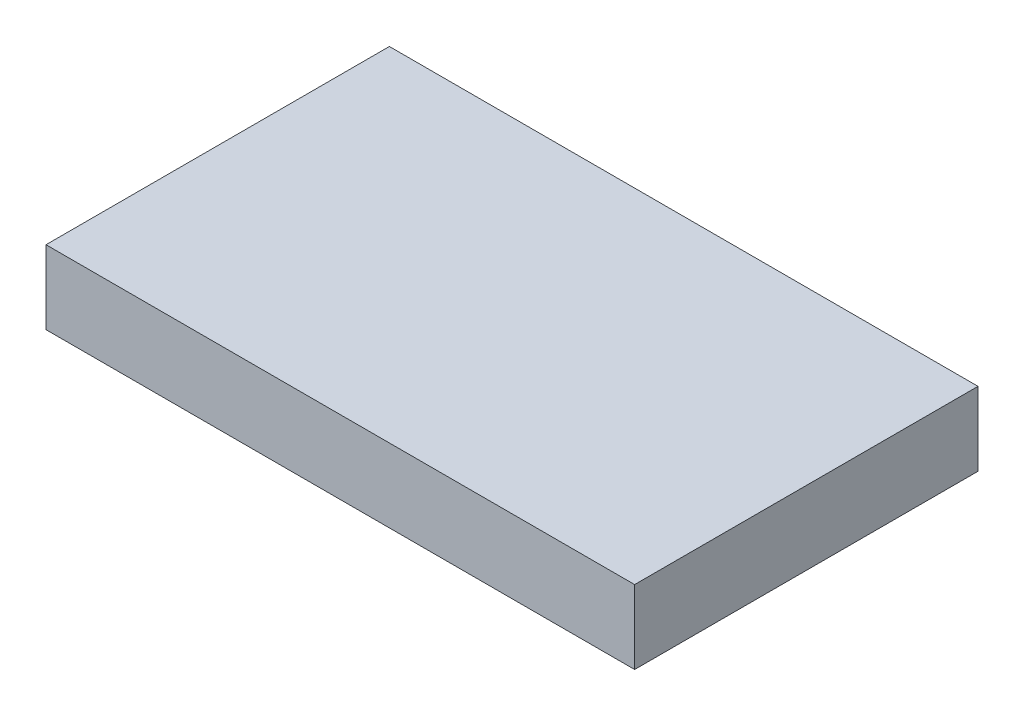
ISO-10303-21;
HEADER;
FILE_DESCRIPTION(('STEP AP214'),'2;1');
FILE_NAME('part.step','',(''),(''),'','','');
FILE_SCHEMA(('AUTOMOTIVE_DESIGN { 1 0 10303 214 1 1 1 1 }'));
ENDSEC;
DATA;
#1=APPLICATION_CONTEXT('core data for automotive mechanical design processes');
#2=APPLICATION_PROTOCOL_DEFINITION('international standard','automotive_design',2000,#1);
#3=PRODUCT_CONTEXT('',#1,'mechanical');
#4=PRODUCT('Part','Part','',(#3));
#5=PRODUCT_RELATED_PRODUCT_CATEGORY('part','',(#4));
#6=PRODUCT_DEFINITION_FORMATION('','',#4);
#7=PRODUCT_DEFINITION_CONTEXT('part definition',#1,'design');
#8=PRODUCT_DEFINITION('design','',#6,#7);
#9=PRODUCT_DEFINITION_SHAPE('','',#8);
#10=(LENGTH_UNIT() NAMED_UNIT(*) SI_UNIT(.MILLI.,.METRE.));
#11=(NAMED_UNIT(*) PLANE_ANGLE_UNIT() SI_UNIT($,.RADIAN.));
#12=(NAMED_UNIT(*) SI_UNIT($,.STERADIAN.) SOLID_ANGLE_UNIT());
#13=UNCERTAINTY_MEASURE_WITH_UNIT(LENGTH_MEASURE(1.E-05),#10,'distance_accuracy_value','');
#14=(GEOMETRIC_REPRESENTATION_CONTEXT(3) GLOBAL_UNCERTAINTY_ASSIGNED_CONTEXT((#13)) GLOBAL_UNIT_ASSIGNED_CONTEXT((#10,
#11,#12)) REPRESENTATION_CONTEXT('',''));
#15=CARTESIAN_POINT('',(0.,0.,0.));
#16=DIRECTION('',(0.,0.,1.));
#17=DIRECTION('',(1.,0.,0.));
#18=AXIS2_PLACEMENT_3D('',#15,#16,#17);
#19=CARTESIAN_POINT('',(0.,15.,0.));
#20=DIRECTION('',(1.,0.,0.));
#21=DIRECTION('',(0.,0.,-1.));
#22=AXIS2_PLACEMENT_3D('',#19,#20,#21);
#23=PLANE('',#22);
#24=DIRECTION('',(0.,0.,1.));
#25=VECTOR('',#24,1.);
#26=CARTESIAN_POINT('',(0.,0.,0.));
#27=LINE('',#26,#25);
#28=CARTESIAN_POINT('',(0.,0.,-70.));
#29=VERTEX_POINT('',#28);
#30=CARTESIAN_POINT('',(0.,0.,0.));
#31=VERTEX_POINT('',#30);
#32=EDGE_CURVE('E107',#29,#31,#27,.T.);
#33=ORIENTED_EDGE('',*,*,#32,.T.);
#34=DIRECTION('',(0.,-1.,0.));
#35=VECTOR('',#34,1.);
#36=CARTESIAN_POINT('',(0.,15.,0.));
#37=LINE('',#36,#35);
#38=CARTESIAN_POINT('',(0.,15.,0.));
#39=VERTEX_POINT('',#38);
#40=EDGE_CURVE('E11',#39,#31,#37,.T.);
#41=ORIENTED_EDGE('',*,*,#40,.F.);
#42=DIRECTION('',(0.,0.,1.));
#43=VECTOR('',#42,1.);
#44=CARTESIAN_POINT('',(0.,15.,0.));
#45=LINE('',#44,#43);
#46=CARTESIAN_POINT('',(0.,15.,-70.));
#47=VERTEX_POINT('',#46);
#48=EDGE_CURVE('E91',#47,#39,#45,.T.);
#49=ORIENTED_EDGE('',*,*,#48,.F.);
#50=DIRECTION('',(0.,-1.,0.));
#51=VECTOR('',#50,1.);
#52=CARTESIAN_POINT('',(0.,15.,-70.));
#53=LINE('',#52,#51);
#54=EDGE_CURVE('E103',#47,#29,#53,.T.);
#55=ORIENTED_EDGE('',*,*,#54,.T.);
#56=EDGE_LOOP('',(#33,#41,#49,#55));
#57=FACE_BOUND('',#56,.T.);
#58=ADVANCED_FACE('F39',(#57),#23,.F.);
#59=CARTESIAN_POINT('',(0.,15.,0.));
#60=DIRECTION('',(0.,0.,-1.));
#61=DIRECTION('',(-1.,0.,0.));
#62=AXIS2_PLACEMENT_3D('',#59,#60,#61);
#63=PLANE('',#62);
#64=DIRECTION('',(1.,0.,0.));
#65=VECTOR('',#64,1.);
#66=CARTESIAN_POINT('',(0.,0.,0.));
#67=LINE('',#66,#65);
#68=CARTESIAN_POINT('',(120.,0.,0.));
#69=VERTEX_POINT('',#68);
#70=EDGE_CURVE('E96',#31,#69,#67,.T.);
#71=ORIENTED_EDGE('',*,*,#70,.T.);
#72=DIRECTION('',(0.,-1.,0.));
#73=VECTOR('',#72,1.);
#74=CARTESIAN_POINT('',(120.,15.,0.));
#75=LINE('',#74,#73);
#76=CARTESIAN_POINT('',(120.,15.,0.));
#77=VERTEX_POINT('',#76);
#78=EDGE_CURVE('E48',#77,#69,#75,.T.);
#79=ORIENTED_EDGE('',*,*,#78,.F.);
#80=DIRECTION('',(1.,0.,0.));
#81=VECTOR('',#80,1.);
#82=CARTESIAN_POINT('',(0.,15.,0.));
#83=LINE('',#82,#81);
#84=EDGE_CURVE('E86',#39,#77,#83,.T.);
#85=ORIENTED_EDGE('',*,*,#84,.F.);
#86=ORIENTED_EDGE('',*,*,#40,.T.);
#87=EDGE_LOOP('',(#71,#79,#85,#86));
#88=FACE_BOUND('',#87,.T.);
#89=ADVANCED_FACE('F95',(#88),#63,.F.);
#90=CARTESIAN_POINT('',(120.,15.,0.));
#91=DIRECTION('',(-1.,0.,0.));
#92=DIRECTION('',(0.,0.,1.));
#93=AXIS2_PLACEMENT_3D('',#90,#91,#92);
#94=PLANE('',#93);
#95=DIRECTION('',(0.,0.,-1.));
#96=VECTOR('',#95,1.);
#97=CARTESIAN_POINT('',(120.,0.,0.));
#98=LINE('',#97,#96);
#99=CARTESIAN_POINT('',(120.,0.,-70.));
#100=VERTEX_POINT('',#99);
#101=EDGE_CURVE('E73',#69,#100,#98,.T.);
#102=ORIENTED_EDGE('',*,*,#101,.T.);
#103=DIRECTION('',(0.,-1.,0.));
#104=VECTOR('',#103,1.);
#105=CARTESIAN_POINT('',(120.,15.,-70.));
#106=LINE('',#105,#104);
#107=CARTESIAN_POINT('',(120.,15.,-70.));
#108=VERTEX_POINT('',#107);
#109=EDGE_CURVE('E98',#108,#100,#106,.T.);
#110=ORIENTED_EDGE('',*,*,#109,.F.);
#111=DIRECTION('',(0.,0.,-1.));
#112=VECTOR('',#111,1.);
#113=CARTESIAN_POINT('',(120.,15.,0.));
#114=LINE('',#113,#112);
#115=EDGE_CURVE('E89',#77,#108,#114,.T.);
#116=ORIENTED_EDGE('',*,*,#115,.F.);
#117=ORIENTED_EDGE('',*,*,#78,.T.);
#118=EDGE_LOOP('',(#102,#110,#116,#117));
#119=FACE_BOUND('',#118,.T.);
#120=ADVANCED_FACE('F99',(#119),#94,.F.);
#121=CARTESIAN_POINT('',(0.,15.,-70.));
#122=DIRECTION('',(0.,0.,1.));
#123=DIRECTION('',(1.,0.,0.));
#124=AXIS2_PLACEMENT_3D('',#121,#122,#123);
#125=PLANE('',#124);
#126=DIRECTION('',(-1.,0.,0.));
#127=VECTOR('',#126,1.);
#128=CARTESIAN_POINT('',(0.,0.,-70.));
#129=LINE('',#128,#127);
#130=EDGE_CURVE('E79',#100,#29,#129,.T.);
#131=ORIENTED_EDGE('',*,*,#130,.T.);
#132=ORIENTED_EDGE('',*,*,#54,.F.);
#133=DIRECTION('',(-1.,0.,0.));
#134=VECTOR('',#133,1.);
#135=CARTESIAN_POINT('',(0.,15.,-70.));
#136=LINE('',#135,#134);
#137=EDGE_CURVE('E56',#108,#47,#136,.T.);
#138=ORIENTED_EDGE('',*,*,#137,.F.);
#139=ORIENTED_EDGE('',*,*,#109,.T.);
#140=EDGE_LOOP('',(#131,#132,#138,#139));
#141=FACE_BOUND('',#140,.T.);
#142=ADVANCED_FACE('F120',(#141),#125,.F.);
#143=CARTESIAN_POINT('',(0.,15.,0.));
#144=DIRECTION('',(0.,-1.,0.));
#145=DIRECTION('',(0.,0.,-1.));
#146=AXIS2_PLACEMENT_3D('',#143,#144,#145);
#147=PLANE('',#146);
#148=ORIENTED_EDGE('',*,*,#48,.T.);
#149=ORIENTED_EDGE('',*,*,#84,.T.);
#150=ORIENTED_EDGE('',*,*,#115,.T.);
#151=ORIENTED_EDGE('',*,*,#137,.T.);
#152=EDGE_LOOP('',(#148,#149,#150,#151));
#153=FACE_BOUND('',#152,.T.);
#154=ADVANCED_FACE('F87',(#153),#147,.F.);
#155=CARTESIAN_POINT('',(0.,0.,0.));
#156=DIRECTION('',(0.,-1.,0.));
#157=DIRECTION('',(0.,0.,-1.));
#158=AXIS2_PLACEMENT_3D('',#155,#156,#157);
#159=PLANE('',#158);
#160=ORIENTED_EDGE('',*,*,#32,.F.);
#161=ORIENTED_EDGE('',*,*,#130,.F.);
#162=ORIENTED_EDGE('',*,*,#101,.F.);
#163=ORIENTED_EDGE('',*,*,#70,.F.);
#164=EDGE_LOOP('',(#160,#161,#162,#163));
#165=FACE_BOUND('',#164,.T.);
#166=ADVANCED_FACE('F123',(#165),#159,.T.);
#167=CLOSED_SHELL('',(#58,#89,#120,#142,#154,#166));
#168=MANIFOLD_SOLID_BREP('B2',#167);
#169=ADVANCED_BREP_SHAPE_REPRESENTATION('',(#18,#168),#14);
#170=SHAPE_DEFINITION_REPRESENTATION(#9,#169);
ENDSEC;
END-ISO-10303-21;
